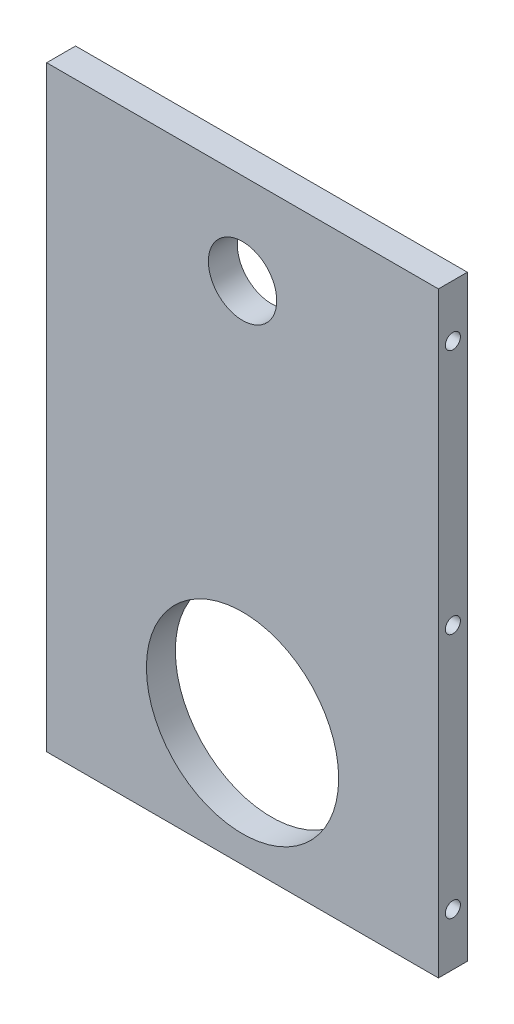
ISO-10303-21;
HEADER;
FILE_DESCRIPTION(('STEP AP214'),'2;1');
FILE_NAME('part.step','',(''),(''),'','','');
FILE_SCHEMA(('AUTOMOTIVE_DESIGN { 1 0 10303 214 1 1 1 1 }'));
ENDSEC;
DATA;
#1=APPLICATION_CONTEXT('core data for automotive mechanical design processes');
#2=APPLICATION_PROTOCOL_DEFINITION('international standard','automotive_design',2000,#1);
#3=PRODUCT_CONTEXT('',#1,'mechanical');
#4=PRODUCT('Part','Part','',(#3));
#5=PRODUCT_RELATED_PRODUCT_CATEGORY('part','',(#4));
#6=PRODUCT_DEFINITION_FORMATION('','',#4);
#7=PRODUCT_DEFINITION_CONTEXT('part definition',#1,'design');
#8=PRODUCT_DEFINITION('design','',#6,#7);
#9=PRODUCT_DEFINITION_SHAPE('','',#8);
#10=(LENGTH_UNIT() NAMED_UNIT(*) SI_UNIT(.MILLI.,.METRE.));
#11=(NAMED_UNIT(*) PLANE_ANGLE_UNIT() SI_UNIT($,.RADIAN.));
#12=(NAMED_UNIT(*) SI_UNIT($,.STERADIAN.) SOLID_ANGLE_UNIT());
#13=UNCERTAINTY_MEASURE_WITH_UNIT(LENGTH_MEASURE(1.E-05),#10,'distance_accuracy_value','');
#14=(GEOMETRIC_REPRESENTATION_CONTEXT(3) GLOBAL_UNCERTAINTY_ASSIGNED_CONTEXT((#13)) GLOBAL_UNIT_ASSIGNED_CONTEXT((#10,
#11,#12)) REPRESENTATION_CONTEXT('',''));
#15=CARTESIAN_POINT('',(0.,0.,0.));
#16=DIRECTION('',(0.,0.,1.));
#17=DIRECTION('',(1.,0.,0.));
#18=AXIS2_PLACEMENT_3D('',#15,#16,#17);
#19=CARTESIAN_POINT('',(43.,-65.5,3.175));
#20=DIRECTION('',(-1.,0.,0.));
#21=DIRECTION('',(0.,0.,1.));
#22=AXIS2_PLACEMENT_3D('',#19,#20,#21);
#23=PLANE('',#22);
#24=CARTESIAN_POINT('',(43.,54.,0.));
#25=DIRECTION('',(-1.,0.,0.));
#26=DIRECTION('',(0.,0.,1.));
#27=AXIS2_PLACEMENT_3D('',#24,#25,#26);
#28=CIRCLE('',#27,1.65);
#29=CARTESIAN_POINT('',(43.,54.,1.64999999999998));
#30=VERTEX_POINT('',#29);
#31=EDGE_CURVE('E150',#30,#30,#28,.T.);
#32=ORIENTED_EDGE('',*,*,#31,.T.);
#33=EDGE_LOOP('',(#32));
#34=FACE_BOUND('',#33,.T.);
#35=CARTESIAN_POINT('',(43.,0.,0.));
#36=DIRECTION('',(-1.,0.,0.));
#37=DIRECTION('',(0.,0.,1.));
#38=AXIS2_PLACEMENT_3D('',#35,#36,#37);
#39=CIRCLE('',#38,1.65);
#40=CARTESIAN_POINT('',(43.,0.,1.65));
#41=VERTEX_POINT('',#40);
#42=EDGE_CURVE('E143',#41,#41,#39,.T.);
#43=ORIENTED_EDGE('',*,*,#42,.T.);
#44=EDGE_LOOP('',(#43));
#45=FACE_BOUND('',#44,.T.);
#46=CARTESIAN_POINT('',(43.,-54.,0.));
#47=DIRECTION('',(-1.,0.,0.));
#48=DIRECTION('',(0.,0.,1.));
#49=AXIS2_PLACEMENT_3D('',#46,#47,#48);
#50=CIRCLE('',#49,1.65);
#51=CARTESIAN_POINT('',(43.,-54.,1.65000000000001));
#52=VERTEX_POINT('',#51);
#53=EDGE_CURVE('E131',#52,#52,#50,.T.);
#54=ORIENTED_EDGE('',*,*,#53,.T.);
#55=EDGE_LOOP('',(#54));
#56=FACE_BOUND('',#55,.T.);
#57=DIRECTION('',(0.,1.,0.));
#58=VECTOR('',#57,1.);
#59=CARTESIAN_POINT('',(43.,-65.5,-3.175));
#60=LINE('',#59,#58);
#61=CARTESIAN_POINT('',(43.,-65.5,-3.175));
#62=VERTEX_POINT('',#61);
#63=CARTESIAN_POINT('',(43.,65.5,-3.175));
#64=VERTEX_POINT('',#63);
#65=EDGE_CURVE('E105',#62,#64,#60,.T.);
#66=ORIENTED_EDGE('',*,*,#65,.T.);
#67=DIRECTION('',(0.,0.,-1.));
#68=VECTOR('',#67,1.);
#69=CARTESIAN_POINT('',(43.,65.5,3.175));
#70=LINE('',#69,#68);
#71=CARTESIAN_POINT('',(43.,65.5,3.175));
#72=VERTEX_POINT('',#71);
#73=EDGE_CURVE('E11',#72,#64,#70,.T.);
#74=ORIENTED_EDGE('',*,*,#73,.F.);
#75=DIRECTION('',(0.,1.,0.));
#76=VECTOR('',#75,1.);
#77=CARTESIAN_POINT('',(43.,-65.5,3.175));
#78=LINE('',#77,#76);
#79=CARTESIAN_POINT('',(43.,-65.5,3.175));
#80=VERTEX_POINT('',#79);
#81=EDGE_CURVE('E89',#80,#72,#78,.T.);
#82=ORIENTED_EDGE('',*,*,#81,.F.);
#83=DIRECTION('',(0.,0.,-1.));
#84=VECTOR('',#83,1.);
#85=CARTESIAN_POINT('',(43.,-65.5,3.175));
#86=LINE('',#85,#84);
#87=EDGE_CURVE('E98',#80,#62,#86,.T.);
#88=ORIENTED_EDGE('',*,*,#87,.T.);
#89=EDGE_LOOP('',(#66,#74,#82,#88));
#90=FACE_BOUND('',#89,.T.);
#91=ADVANCED_FACE('F39',(#34,#45,#56,#90),#23,.F.);
#92=CARTESIAN_POINT('',(-43.,65.5,3.175));
#93=DIRECTION('',(0.,-1.,0.));
#94=DIRECTION('',(0.,0.,-1.));
#95=AXIS2_PLACEMENT_3D('',#92,#93,#94);
#96=PLANE('',#95);
#97=DIRECTION('',(-1.,0.,0.));
#98=VECTOR('',#97,1.);
#99=CARTESIAN_POINT('',(-43.,65.5,-3.175));
#100=LINE('',#99,#98);
#101=CARTESIAN_POINT('',(-43.,65.5,-3.175));
#102=VERTEX_POINT('',#101);
#103=EDGE_CURVE('E94',#64,#102,#100,.T.);
#104=ORIENTED_EDGE('',*,*,#103,.T.);
#105=DIRECTION('',(0.,0.,-1.));
#106=VECTOR('',#105,1.);
#107=CARTESIAN_POINT('',(-43.,65.5,3.175));
#108=LINE('',#107,#106);
#109=CARTESIAN_POINT('',(-43.,65.5,3.175));
#110=VERTEX_POINT('',#109);
#111=EDGE_CURVE('E50',#110,#102,#108,.T.);
#112=ORIENTED_EDGE('',*,*,#111,.F.);
#113=DIRECTION('',(-1.,0.,0.));
#114=VECTOR('',#113,1.);
#115=CARTESIAN_POINT('',(-43.,65.5,3.175));
#116=LINE('',#115,#114);
#117=EDGE_CURVE('E83',#72,#110,#116,.T.);
#118=ORIENTED_EDGE('',*,*,#117,.F.);
#119=ORIENTED_EDGE('',*,*,#73,.T.);
#120=EDGE_LOOP('',(#104,#112,#118,#119));
#121=FACE_BOUND('',#120,.T.);
#122=ADVANCED_FACE('F91',(#121),#96,.F.);
#123=CARTESIAN_POINT('',(-43.,-65.5,3.175));
#124=DIRECTION('',(1.,0.,0.));
#125=DIRECTION('',(0.,0.,-1.));
#126=AXIS2_PLACEMENT_3D('',#123,#124,#125);
#127=PLANE('',#126);
#128=CARTESIAN_POINT('',(-43.,54.,0.));
#129=DIRECTION('',(-1.,0.,0.));
#130=DIRECTION('',(0.,0.,1.));
#131=AXIS2_PLACEMENT_3D('',#128,#129,#130);
#132=CIRCLE('',#131,1.65);
#133=CARTESIAN_POINT('',(-43.,54.,1.64999999999998));
#134=VERTEX_POINT('',#133);
#135=EDGE_CURVE('E129',#134,#134,#132,.T.);
#136=ORIENTED_EDGE('',*,*,#135,.F.);
#137=EDGE_LOOP('',(#136));
#138=FACE_BOUND('',#137,.T.);
#139=CARTESIAN_POINT('',(-43.,0.,0.));
#140=DIRECTION('',(-1.,0.,0.));
#141=DIRECTION('',(0.,0.,1.));
#142=AXIS2_PLACEMENT_3D('',#139,#140,#141);
#143=CIRCLE('',#142,1.65);
#144=CARTESIAN_POINT('',(-43.,0.,1.65));
#145=VERTEX_POINT('',#144);
#146=EDGE_CURVE('E127',#145,#145,#143,.T.);
#147=ORIENTED_EDGE('',*,*,#146,.F.);
#148=EDGE_LOOP('',(#147));
#149=FACE_BOUND('',#148,.T.);
#150=CARTESIAN_POINT('',(-43.,-54.,0.));
#151=DIRECTION('',(-1.,0.,0.));
#152=DIRECTION('',(0.,0.,1.));
#153=AXIS2_PLACEMENT_3D('',#150,#151,#152);
#154=CIRCLE('',#153,1.65);
#155=CARTESIAN_POINT('',(-43.,-54.,1.65000000000001));
#156=VERTEX_POINT('',#155);
#157=EDGE_CURVE('E116',#156,#156,#154,.T.);
#158=ORIENTED_EDGE('',*,*,#157,.F.);
#159=EDGE_LOOP('',(#158));
#160=FACE_BOUND('',#159,.T.);
#161=DIRECTION('',(0.,-1.,0.));
#162=VECTOR('',#161,1.);
#163=CARTESIAN_POINT('',(-43.,-65.5,-3.175));
#164=LINE('',#163,#162);
#165=CARTESIAN_POINT('',(-43.,-65.5,-3.175));
#166=VERTEX_POINT('',#165);
#167=EDGE_CURVE('E75',#102,#166,#164,.T.);
#168=ORIENTED_EDGE('',*,*,#167,.T.);
#169=DIRECTION('',(0.,0.,-1.));
#170=VECTOR('',#169,1.);
#171=CARTESIAN_POINT('',(-43.,-65.5,3.175));
#172=LINE('',#171,#170);
#173=CARTESIAN_POINT('',(-43.,-65.5,3.175));
#174=VERTEX_POINT('',#173);
#175=EDGE_CURVE('E92',#174,#166,#172,.T.);
#176=ORIENTED_EDGE('',*,*,#175,.F.);
#177=DIRECTION('',(0.,-1.,0.));
#178=VECTOR('',#177,1.);
#179=CARTESIAN_POINT('',(-43.,-65.5,3.175));
#180=LINE('',#179,#178);
#181=EDGE_CURVE('E86',#110,#174,#180,.T.);
#182=ORIENTED_EDGE('',*,*,#181,.F.);
#183=ORIENTED_EDGE('',*,*,#111,.T.);
#184=EDGE_LOOP('',(#168,#176,#182,#183));
#185=FACE_BOUND('',#184,.T.);
#186=ADVANCED_FACE('F96',(#138,#149,#160,#185),#127,.F.);
#187=CARTESIAN_POINT('',(-43.,-65.5,3.175));
#188=DIRECTION('',(0.,1.,0.));
#189=DIRECTION('',(0.,0.,1.));
#190=AXIS2_PLACEMENT_3D('',#187,#188,#189);
#191=PLANE('',#190);
#192=DIRECTION('',(1.,0.,0.));
#193=VECTOR('',#192,1.);
#194=CARTESIAN_POINT('',(-43.,-65.5,-3.175));
#195=LINE('',#194,#193);
#196=EDGE_CURVE('E79',#166,#62,#195,.T.);
#197=ORIENTED_EDGE('',*,*,#196,.T.);
#198=ORIENTED_EDGE('',*,*,#87,.F.);
#199=DIRECTION('',(1.,0.,0.));
#200=VECTOR('',#199,1.);
#201=CARTESIAN_POINT('',(-43.,-65.5,3.175));
#202=LINE('',#201,#200);
#203=EDGE_CURVE('E54',#174,#80,#202,.T.);
#204=ORIENTED_EDGE('',*,*,#203,.F.);
#205=ORIENTED_EDGE('',*,*,#175,.T.);
#206=EDGE_LOOP('',(#197,#198,#204,#205));
#207=FACE_BOUND('',#206,.T.);
#208=ADVANCED_FACE('F109',(#207),#191,.F.);
#209=CARTESIAN_POINT('',(0.,0.,3.175));
#210=DIRECTION('',(0.,0.,-1.));
#211=DIRECTION('',(-1.,0.,0.));
#212=AXIS2_PLACEMENT_3D('',#209,#210,#211);
#213=PLANE('',#212);
#214=CARTESIAN_POINT('',(0.,-38.5,3.175));
#215=DIRECTION('',(0.,0.,1.));
#216=DIRECTION('',(1.,0.,0.));
#217=AXIS2_PLACEMENT_3D('',#214,#215,#216);
#218=CIRCLE('',#217,21.1);
#219=CARTESIAN_POINT('',(21.1,-38.5,3.175));
#220=VERTEX_POINT('',#219);
#221=EDGE_CURVE('E158',#220,#220,#218,.T.);
#222=ORIENTED_EDGE('',*,*,#221,.F.);
#223=EDGE_LOOP('',(#222));
#224=FACE_BOUND('',#223,.T.);
#225=CARTESIAN_POINT('',(0.,45.5,3.175));
#226=DIRECTION('',(0.,0.,1.));
#227=DIRECTION('',(1.,0.,0.));
#228=AXIS2_PLACEMENT_3D('',#225,#226,#227);
#229=CIRCLE('',#228,7.5);
#230=CARTESIAN_POINT('',(7.5,45.5,3.175));
#231=VERTEX_POINT('',#230);
#232=EDGE_CURVE('E155',#231,#231,#229,.T.);
#233=ORIENTED_EDGE('',*,*,#232,.F.);
#234=EDGE_LOOP('',(#233));
#235=FACE_BOUND('',#234,.T.);
#236=ORIENTED_EDGE('',*,*,#81,.T.);
#237=ORIENTED_EDGE('',*,*,#117,.T.);
#238=ORIENTED_EDGE('',*,*,#181,.T.);
#239=ORIENTED_EDGE('',*,*,#203,.T.);
#240=EDGE_LOOP('',(#236,#237,#238,#239));
#241=FACE_BOUND('',#240,.T.);
#242=ADVANCED_FACE('F88',(#224,#235,#241),#213,.F.);
#243=CARTESIAN_POINT('',(0.,0.,-3.175));
#244=DIRECTION('',(0.,0.,-1.));
#245=DIRECTION('',(-1.,0.,0.));
#246=AXIS2_PLACEMENT_3D('',#243,#244,#245);
#247=PLANE('',#246);
#248=CARTESIAN_POINT('',(0.,-38.5,-3.175));
#249=DIRECTION('',(0.,0.,1.));
#250=DIRECTION('',(1.,0.,0.));
#251=AXIS2_PLACEMENT_3D('',#248,#249,#250);
#252=CIRCLE('',#251,21.1);
#253=CARTESIAN_POINT('',(21.1,-38.5,-3.175));
#254=VERTEX_POINT('',#253);
#255=EDGE_CURVE('E154',#254,#254,#252,.T.);
#256=ORIENTED_EDGE('',*,*,#255,.T.);
#257=EDGE_LOOP('',(#256));
#258=FACE_BOUND('',#257,.T.);
#259=CARTESIAN_POINT('',(0.,45.5,-3.175));
#260=DIRECTION('',(0.,0.,1.));
#261=DIRECTION('',(1.,0.,0.));
#262=AXIS2_PLACEMENT_3D('',#259,#260,#261);
#263=CIRCLE('',#262,7.5);
#264=CARTESIAN_POINT('',(7.5,45.5,-3.175));
#265=VERTEX_POINT('',#264);
#266=EDGE_CURVE('E140',#265,#265,#263,.T.);
#267=ORIENTED_EDGE('',*,*,#266,.T.);
#268=EDGE_LOOP('',(#267));
#269=FACE_BOUND('',#268,.T.);
#270=ORIENTED_EDGE('',*,*,#65,.F.);
#271=ORIENTED_EDGE('',*,*,#196,.F.);
#272=ORIENTED_EDGE('',*,*,#167,.F.);
#273=ORIENTED_EDGE('',*,*,#103,.F.);
#274=EDGE_LOOP('',(#270,#271,#272,#273));
#275=FACE_BOUND('',#274,.T.);
#276=ADVANCED_FACE('F114',(#258,#269,#275),#247,.T.);
#277=CARTESIAN_POINT('',(-33.,-54.,0.));
#278=DIRECTION('',(-1.,0.,0.));
#279=DIRECTION('',(0.,0.,1.));
#280=AXIS2_PLACEMENT_3D('',#277,#278,#279);
#281=CYLINDRICAL_SURFACE('',#280,1.65);
#282=CARTESIAN_POINT('',(-33.,-54.,0.));
#283=DIRECTION('',(-1.,0.,0.));
#284=DIRECTION('',(0.,0.,1.));
#285=AXIS2_PLACEMENT_3D('',#282,#283,#284);
#286=CIRCLE('',#285,1.65);
#287=CARTESIAN_POINT('',(-33.,-54.,1.65000000000001));
#288=VERTEX_POINT('',#287);
#289=EDGE_CURVE('E117',#288,#288,#286,.T.);
#290=ORIENTED_EDGE('',*,*,#289,.F.);
#291=EDGE_LOOP('',(#290));
#292=FACE_BOUND('',#291,.T.);
#293=ORIENTED_EDGE('',*,*,#157,.T.);
#294=EDGE_LOOP('',(#293));
#295=FACE_BOUND('',#294,.T.);
#296=ADVANCED_FACE('F228',(#292,#295),#281,.F.);
#297=CARTESIAN_POINT('',(-33.,-54.,0.));
#298=DIRECTION('',(-1.,0.,0.));
#299=DIRECTION('',(0.,0.,1.));
#300=AXIS2_PLACEMENT_3D('',#297,#298,#299);
#301=PLANE('',#300);
#302=ORIENTED_EDGE('',*,*,#289,.T.);
#303=EDGE_LOOP('',(#302));
#304=FACE_BOUND('',#303,.T.);
#305=ADVANCED_FACE('F223',(#304),#301,.T.);
#306=CARTESIAN_POINT('',(-33.,0.,0.));
#307=DIRECTION('',(-1.,0.,0.));
#308=DIRECTION('',(0.,0.,1.));
#309=AXIS2_PLACEMENT_3D('',#306,#307,#308);
#310=CYLINDRICAL_SURFACE('',#309,1.65);
#311=CARTESIAN_POINT('',(-33.,0.,0.));
#312=DIRECTION('',(-1.,0.,0.));
#313=DIRECTION('',(0.,0.,1.));
#314=AXIS2_PLACEMENT_3D('',#311,#312,#313);
#315=CIRCLE('',#314,1.65);
#316=CARTESIAN_POINT('',(-33.,0.,1.65));
#317=VERTEX_POINT('',#316);
#318=EDGE_CURVE('E125',#317,#317,#315,.T.);
#319=ORIENTED_EDGE('',*,*,#318,.F.);
#320=EDGE_LOOP('',(#319));
#321=FACE_BOUND('',#320,.T.);
#322=ORIENTED_EDGE('',*,*,#146,.T.);
#323=EDGE_LOOP('',(#322));
#324=FACE_BOUND('',#323,.T.);
#325=ADVANCED_FACE('F225',(#321,#324),#310,.F.);
#326=CARTESIAN_POINT('',(-33.,0.,0.));
#327=DIRECTION('',(-1.,0.,0.));
#328=DIRECTION('',(0.,0.,1.));
#329=AXIS2_PLACEMENT_3D('',#326,#327,#328);
#330=PLANE('',#329);
#331=ORIENTED_EDGE('',*,*,#318,.T.);
#332=EDGE_LOOP('',(#331));
#333=FACE_BOUND('',#332,.T.);
#334=ADVANCED_FACE('F219',(#333),#330,.T.);
#335=CARTESIAN_POINT('',(-33.,54.,0.));
#336=DIRECTION('',(-1.,0.,0.));
#337=DIRECTION('',(0.,0.,1.));
#338=AXIS2_PLACEMENT_3D('',#335,#336,#337);
#339=CYLINDRICAL_SURFACE('',#338,1.65);
#340=CARTESIAN_POINT('',(-33.,54.,0.));
#341=DIRECTION('',(-1.,0.,0.));
#342=DIRECTION('',(0.,0.,1.));
#343=AXIS2_PLACEMENT_3D('',#340,#341,#342);
#344=CIRCLE('',#343,1.65);
#345=CARTESIAN_POINT('',(-33.,54.,1.64999999999998));
#346=VERTEX_POINT('',#345);
#347=EDGE_CURVE('E104',#346,#346,#344,.T.);
#348=ORIENTED_EDGE('',*,*,#347,.F.);
#349=EDGE_LOOP('',(#348));
#350=FACE_BOUND('',#349,.T.);
#351=ORIENTED_EDGE('',*,*,#135,.T.);
#352=EDGE_LOOP('',(#351));
#353=FACE_BOUND('',#352,.T.);
#354=ADVANCED_FACE('F213',(#350,#353),#339,.F.);
#355=CARTESIAN_POINT('',(-33.,54.,0.));
#356=DIRECTION('',(-1.,0.,0.));
#357=DIRECTION('',(0.,0.,1.));
#358=AXIS2_PLACEMENT_3D('',#355,#356,#357);
#359=PLANE('',#358);
#360=ORIENTED_EDGE('',*,*,#347,.T.);
#361=EDGE_LOOP('',(#360));
#362=FACE_BOUND('',#361,.T.);
#363=ADVANCED_FACE('F204',(#362),#359,.T.);
#364=CARTESIAN_POINT('',(33.,-54.,0.));
#365=DIRECTION('',(1.,0.,0.));
#366=DIRECTION('',(0.,0.,-1.));
#367=AXIS2_PLACEMENT_3D('',#364,#365,#366);
#368=CYLINDRICAL_SURFACE('',#367,1.65);
#369=CARTESIAN_POINT('',(33.,-54.,0.));
#370=DIRECTION('',(-1.,0.,0.));
#371=DIRECTION('',(0.,0.,1.));
#372=AXIS2_PLACEMENT_3D('',#369,#370,#371);
#373=CIRCLE('',#372,1.65);
#374=CARTESIAN_POINT('',(33.,-54.,1.65000000000001));
#375=VERTEX_POINT('',#374);
#376=EDGE_CURVE('E139',#375,#375,#373,.T.);
#377=ORIENTED_EDGE('',*,*,#376,.T.);
#378=EDGE_LOOP('',(#377));
#379=FACE_BOUND('',#378,.T.);
#380=ORIENTED_EDGE('',*,*,#53,.F.);
#381=EDGE_LOOP('',(#380));
#382=FACE_BOUND('',#381,.T.);
#383=ADVANCED_FACE('F205',(#379,#382),#368,.F.);
#384=CARTESIAN_POINT('',(33.,-54.,0.));
#385=DIRECTION('',(1.,0.,0.));
#386=DIRECTION('',(0.,0.,1.));
#387=AXIS2_PLACEMENT_3D('',#384,#385,#386);
#388=PLANE('',#387);
#389=ORIENTED_EDGE('',*,*,#376,.F.);
#390=EDGE_LOOP('',(#389));
#391=FACE_BOUND('',#390,.T.);
#392=ADVANCED_FACE('F201',(#391),#388,.T.);
#393=CARTESIAN_POINT('',(33.,0.,0.));
#394=DIRECTION('',(1.,0.,0.));
#395=DIRECTION('',(0.,0.,-1.));
#396=AXIS2_PLACEMENT_3D('',#393,#394,#395);
#397=CYLINDRICAL_SURFACE('',#396,1.65);
#398=CARTESIAN_POINT('',(33.,0.,0.));
#399=DIRECTION('',(-1.,0.,0.));
#400=DIRECTION('',(0.,0.,1.));
#401=AXIS2_PLACEMENT_3D('',#398,#399,#400);
#402=CIRCLE('',#401,1.65);
#403=CARTESIAN_POINT('',(33.,0.,1.65));
#404=VERTEX_POINT('',#403);
#405=EDGE_CURVE('E145',#404,#404,#402,.T.);
#406=ORIENTED_EDGE('',*,*,#405,.T.);
#407=EDGE_LOOP('',(#406));
#408=FACE_BOUND('',#407,.T.);
#409=ORIENTED_EDGE('',*,*,#42,.F.);
#410=EDGE_LOOP('',(#409));
#411=FACE_BOUND('',#410,.T.);
#412=ADVANCED_FACE('F209',(#408,#411),#397,.F.);
#413=CARTESIAN_POINT('',(33.,0.,0.));
#414=DIRECTION('',(1.,0.,0.));
#415=DIRECTION('',(0.,0.,1.));
#416=AXIS2_PLACEMENT_3D('',#413,#414,#415);
#417=PLANE('',#416);
#418=ORIENTED_EDGE('',*,*,#405,.F.);
#419=EDGE_LOOP('',(#418));
#420=FACE_BOUND('',#419,.T.);
#421=ADVANCED_FACE('F307',(#420),#417,.T.);
#422=CARTESIAN_POINT('',(33.,54.,0.));
#423=DIRECTION('',(1.,0.,0.));
#424=DIRECTION('',(0.,0.,-1.));
#425=AXIS2_PLACEMENT_3D('',#422,#423,#424);
#426=CYLINDRICAL_SURFACE('',#425,1.65);
#427=CARTESIAN_POINT('',(33.,54.,0.));
#428=DIRECTION('',(-1.,0.,0.));
#429=DIRECTION('',(0.,0.,1.));
#430=AXIS2_PLACEMENT_3D('',#427,#428,#429);
#431=CIRCLE('',#430,1.65);
#432=CARTESIAN_POINT('',(33.,54.,1.64999999999998));
#433=VERTEX_POINT('',#432);
#434=EDGE_CURVE('E118',#433,#433,#431,.T.);
#435=ORIENTED_EDGE('',*,*,#434,.T.);
#436=EDGE_LOOP('',(#435));
#437=FACE_BOUND('',#436,.T.);
#438=ORIENTED_EDGE('',*,*,#31,.F.);
#439=EDGE_LOOP('',(#438));
#440=FACE_BOUND('',#439,.T.);
#441=ADVANCED_FACE('F183',(#437,#440),#426,.F.);
#442=CARTESIAN_POINT('',(33.,54.,0.));
#443=DIRECTION('',(1.,0.,0.));
#444=DIRECTION('',(0.,0.,1.));
#445=AXIS2_PLACEMENT_3D('',#442,#443,#444);
#446=PLANE('',#445);
#447=ORIENTED_EDGE('',*,*,#434,.F.);
#448=EDGE_LOOP('',(#447));
#449=FACE_BOUND('',#448,.T.);
#450=ADVANCED_FACE('F176',(#449),#446,.T.);
#451=CARTESIAN_POINT('',(0.,45.5,-3.175));
#452=DIRECTION('',(0.,0.,1.));
#453=DIRECTION('',(1.,0.,0.));
#454=AXIS2_PLACEMENT_3D('',#451,#452,#453);
#455=CYLINDRICAL_SURFACE('',#454,7.5);
#456=ORIENTED_EDGE('',*,*,#266,.F.);
#457=EDGE_LOOP('',(#456));
#458=FACE_BOUND('',#457,.T.);
#459=ORIENTED_EDGE('',*,*,#232,.T.);
#460=EDGE_LOOP('',(#459));
#461=FACE_BOUND('',#460,.T.);
#462=ADVANCED_FACE('F166',(#458,#461),#455,.F.);
#463=CARTESIAN_POINT('',(0.,-38.5,-3.175));
#464=DIRECTION('',(0.,0.,1.));
#465=DIRECTION('',(1.,0.,0.));
#466=AXIS2_PLACEMENT_3D('',#463,#464,#465);
#467=CYLINDRICAL_SURFACE('',#466,21.1);
#468=ORIENTED_EDGE('',*,*,#255,.F.);
#469=EDGE_LOOP('',(#468));
#470=FACE_BOUND('',#469,.T.);
#471=ORIENTED_EDGE('',*,*,#221,.T.);
#472=EDGE_LOOP('',(#471));
#473=FACE_BOUND('',#472,.T.);
#474=ADVANCED_FACE('F167',(#470,#473),#467,.F.);
#475=CLOSED_SHELL('',(#91,#122,#186,#208,#242,#276,#296,#305,#325,#334,#354,#363,#383,#392,#412,
#421,#441,#450,#462,#474));
#476=MANIFOLD_SOLID_BREP('B2',#475);
#477=ADVANCED_BREP_SHAPE_REPRESENTATION('',(#18,#476),#14);
#478=SHAPE_DEFINITION_REPRESENTATION(#9,#477);
ENDSEC;
END-ISO-10303-21;
